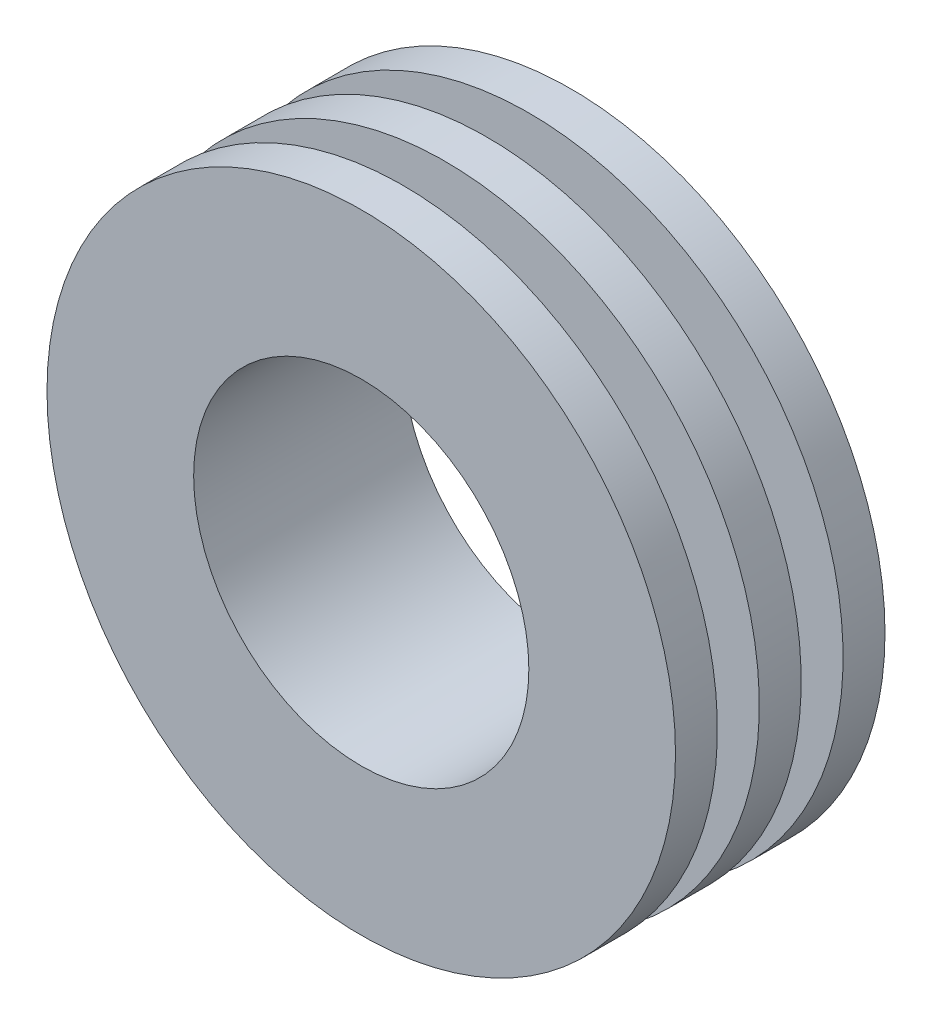
ISO-10303-21;
HEADER;
FILE_DESCRIPTION(('STEP AP214'),'2;1');
FILE_NAME('part.step','',(''),(''),'','','');
FILE_SCHEMA(('AUTOMOTIVE_DESIGN { 1 0 10303 214 1 1 1 1 }'));
ENDSEC;
DATA;
#1=APPLICATION_CONTEXT('core data for automotive mechanical design processes');
#2=APPLICATION_PROTOCOL_DEFINITION('international standard','automotive_design',2000,#1);
#3=PRODUCT_CONTEXT('',#1,'mechanical');
#4=PRODUCT('Part','Part','',(#3));
#5=PRODUCT_RELATED_PRODUCT_CATEGORY('part','',(#4));
#6=PRODUCT_DEFINITION_FORMATION('','',#4);
#7=PRODUCT_DEFINITION_CONTEXT('part definition',#1,'design');
#8=PRODUCT_DEFINITION('design','',#6,#7);
#9=PRODUCT_DEFINITION_SHAPE('','',#8);
#10=(LENGTH_UNIT() NAMED_UNIT(*) SI_UNIT(.MILLI.,.METRE.));
#11=(NAMED_UNIT(*) PLANE_ANGLE_UNIT() SI_UNIT($,.RADIAN.));
#12=(NAMED_UNIT(*) SI_UNIT($,.STERADIAN.) SOLID_ANGLE_UNIT());
#13=UNCERTAINTY_MEASURE_WITH_UNIT(LENGTH_MEASURE(1.E-05),#10,'distance_accuracy_value','');
#14=(GEOMETRIC_REPRESENTATION_CONTEXT(3) GLOBAL_UNCERTAINTY_ASSIGNED_CONTEXT((#13)) GLOBAL_UNIT_ASSIGNED_CONTEXT((#10,
#11,#12)) REPRESENTATION_CONTEXT('',''));
#15=CARTESIAN_POINT('',(0.,0.,0.));
#16=DIRECTION('',(0.,0.,1.));
#17=DIRECTION('',(1.,0.,0.));
#18=AXIS2_PLACEMENT_3D('',#15,#16,#17);
#19=CARTESIAN_POINT('',(0.,0.,5.));
#20=DIRECTION('',(0.,0.,-1.));
#21=DIRECTION('',(-1.,0.,0.));
#22=AXIS2_PLACEMENT_3D('',#19,#20,#21);
#23=CYLINDRICAL_SURFACE('',#22,7.5);
#24=CARTESIAN_POINT('',(0.,0.,2.));
#25=DIRECTION('',(0.,0.,-1.));
#26=DIRECTION('',(-1.,0.,0.));
#27=AXIS2_PLACEMENT_3D('',#24,#25,#26);
#28=CIRCLE('',#27,7.5);
#29=CARTESIAN_POINT('',(-7.5,0.,2.));
#30=VERTEX_POINT('',#29);
#31=EDGE_CURVE('E63',#30,#30,#28,.T.);
#32=ORIENTED_EDGE('',*,*,#31,.F.);
#33=EDGE_LOOP('',(#32));
#34=FACE_BOUND('',#33,.T.);
#35=CARTESIAN_POINT('',(0.,0.,3.));
#36=DIRECTION('',(0.,0.,-1.));
#37=DIRECTION('',(-1.,0.,0.));
#38=AXIS2_PLACEMENT_3D('',#35,#36,#37);
#39=CIRCLE('',#38,7.5);
#40=CARTESIAN_POINT('',(-7.5,0.,3.));
#41=VERTEX_POINT('',#40);
#42=EDGE_CURVE('E57',#41,#41,#39,.T.);
#43=ORIENTED_EDGE('',*,*,#42,.T.);
#44=EDGE_LOOP('',(#43));
#45=FACE_BOUND('',#44,.T.);
#46=ADVANCED_FACE('F33',(#34,#45),#23,.T.);
#47=CARTESIAN_POINT('',(0.,0.,4.));
#48=DIRECTION('',(0.,0.,-1.));
#49=DIRECTION('',(-1.,0.,0.));
#50=AXIS2_PLACEMENT_3D('',#47,#48,#49);
#51=CIRCLE('',#50,7.5);
#52=CARTESIAN_POINT('',(-7.5,0.,4.));
#53=VERTEX_POINT('',#52);
#54=EDGE_CURVE('E60',#53,#53,#51,.T.);
#55=ORIENTED_EDGE('',*,*,#54,.F.);
#56=EDGE_LOOP('',(#55));
#57=FACE_BOUND('',#56,.T.);
#58=CARTESIAN_POINT('',(0.,0.,5.));
#59=DIRECTION('',(0.,0.,1.));
#60=DIRECTION('',(1.,0.,0.));
#61=AXIS2_PLACEMENT_3D('',#58,#59,#60);
#62=CIRCLE('',#61,7.5);
#63=CARTESIAN_POINT('',(7.5,0.,5.));
#64=VERTEX_POINT('',#63);
#65=EDGE_CURVE('E10',#64,#64,#62,.T.);
#66=ORIENTED_EDGE('',*,*,#65,.F.);
#67=EDGE_LOOP('',(#66));
#68=FACE_BOUND('',#67,.T.);
#69=ADVANCED_FACE('F99',(#57,#68),#23,.T.);
#70=CARTESIAN_POINT('',(0.,0.,5.));
#71=DIRECTION('',(0.,0.,1.));
#72=DIRECTION('',(1.,0.,0.));
#73=AXIS2_PLACEMENT_3D('',#70,#71,#72);
#74=PLANE('',#73);
#75=ORIENTED_EDGE('',*,*,#65,.T.);
#76=EDGE_LOOP('',(#75));
#77=FACE_BOUND('',#76,.T.);
#78=CARTESIAN_POINT('',(0.,0.,5.));
#79=DIRECTION('',(0.,0.,1.));
#80=DIRECTION('',(1.,0.,0.));
#81=AXIS2_PLACEMENT_3D('',#78,#79,#80);
#82=CIRCLE('',#81,4.);
#83=CARTESIAN_POINT('',(4.,0.,5.));
#84=VERTEX_POINT('',#83);
#85=EDGE_CURVE('E44',#84,#84,#82,.T.);
#86=ORIENTED_EDGE('',*,*,#85,.F.);
#87=EDGE_LOOP('',(#86));
#88=FACE_BOUND('',#87,.T.);
#89=ADVANCED_FACE('F122',(#77,#88),#74,.T.);
#90=CARTESIAN_POINT('',(0.,0.,0.));
#91=DIRECTION('',(0.,0.,1.));
#92=DIRECTION('',(1.,0.,0.));
#93=AXIS2_PLACEMENT_3D('',#90,#91,#92);
#94=PLANE('',#93);
#95=CARTESIAN_POINT('',(0.,0.,0.));
#96=DIRECTION('',(0.,0.,1.));
#97=DIRECTION('',(1.,0.,0.));
#98=AXIS2_PLACEMENT_3D('',#95,#96,#97);
#99=CIRCLE('',#98,7.5);
#100=CARTESIAN_POINT('',(7.5,0.,0.));
#101=VERTEX_POINT('',#100);
#102=EDGE_CURVE('E37',#101,#101,#99,.T.);
#103=ORIENTED_EDGE('',*,*,#102,.F.);
#104=EDGE_LOOP('',(#103));
#105=FACE_BOUND('',#104,.T.);
#106=CARTESIAN_POINT('',(0.,0.,0.));
#107=DIRECTION('',(0.,0.,1.));
#108=DIRECTION('',(1.,0.,0.));
#109=AXIS2_PLACEMENT_3D('',#106,#107,#108);
#110=CIRCLE('',#109,4.);
#111=CARTESIAN_POINT('',(4.,0.,0.));
#112=VERTEX_POINT('',#111);
#113=EDGE_CURVE('E46',#112,#112,#110,.T.);
#114=ORIENTED_EDGE('',*,*,#113,.T.);
#115=EDGE_LOOP('',(#114));
#116=FACE_BOUND('',#115,.T.);
#117=ADVANCED_FACE('F126',(#105,#116),#94,.F.);
#118=CARTESIAN_POINT('',(0.,0.,1.));
#119=DIRECTION('',(0.,0.,-1.));
#120=DIRECTION('',(-1.,0.,0.));
#121=AXIS2_PLACEMENT_3D('',#118,#119,#120);
#122=CIRCLE('',#121,7.5);
#123=CARTESIAN_POINT('',(-7.5,0.,1.));
#124=VERTEX_POINT('',#123);
#125=EDGE_CURVE('E72',#124,#124,#122,.T.);
#126=ORIENTED_EDGE('',*,*,#125,.T.);
#127=EDGE_LOOP('',(#126));
#128=FACE_BOUND('',#127,.T.);
#129=ORIENTED_EDGE('',*,*,#102,.T.);
#130=EDGE_LOOP('',(#129));
#131=FACE_BOUND('',#130,.T.);
#132=ADVANCED_FACE('F35',(#128,#131),#23,.T.);
#133=CARTESIAN_POINT('',(0.,0.,5.));
#134=DIRECTION('',(0.,0.,-1.));
#135=DIRECTION('',(-1.,0.,0.));
#136=AXIS2_PLACEMENT_3D('',#133,#134,#135);
#137=CYLINDRICAL_SURFACE('',#136,4.);
#138=ORIENTED_EDGE('',*,*,#85,.T.);
#139=EDGE_LOOP('',(#138));
#140=FACE_BOUND('',#139,.T.);
#141=ORIENTED_EDGE('',*,*,#113,.F.);
#142=EDGE_LOOP('',(#141));
#143=FACE_BOUND('',#142,.T.);
#144=ADVANCED_FACE('F116',(#140,#143),#137,.F.);
#145=CARTESIAN_POINT('',(0.,7.5,4.));
#146=DIRECTION('',(0.,0.,1.));
#147=DIRECTION('',(1.,0.,0.));
#148=AXIS2_PLACEMENT_3D('',#145,#146,#147);
#149=PLANE('',#148);
#150=CARTESIAN_POINT('',(0.,0.,4.));
#151=DIRECTION('',(0.,0.,-1.));
#152=DIRECTION('',(-1.,0.,0.));
#153=AXIS2_PLACEMENT_3D('',#150,#151,#152);
#154=CIRCLE('',#153,6.);
#155=CARTESIAN_POINT('',(-6.,0.,4.));
#156=VERTEX_POINT('',#155);
#157=EDGE_CURVE('E49',#156,#156,#154,.T.);
#158=ORIENTED_EDGE('',*,*,#157,.F.);
#159=EDGE_LOOP('',(#158));
#160=FACE_BOUND('',#159,.T.);
#161=ORIENTED_EDGE('',*,*,#54,.T.);
#162=EDGE_LOOP('',(#161));
#163=FACE_BOUND('',#162,.T.);
#164=ADVANCED_FACE('F110',(#160,#163),#149,.F.);
#165=CARTESIAN_POINT('',(0.,0.,0.));
#166=DIRECTION('',(0.,0.,-1.));
#167=DIRECTION('',(-1.,0.,0.));
#168=AXIS2_PLACEMENT_3D('',#165,#166,#167);
#169=CYLINDRICAL_SURFACE('',#168,6.);
#170=CARTESIAN_POINT('',(0.,0.,3.));
#171=DIRECTION('',(0.,0.,-1.));
#172=DIRECTION('',(-1.,0.,0.));
#173=AXIS2_PLACEMENT_3D('',#170,#171,#172);
#174=CIRCLE('',#173,6.);
#175=CARTESIAN_POINT('',(-6.,0.,3.));
#176=VERTEX_POINT('',#175);
#177=EDGE_CURVE('E54',#176,#176,#174,.T.);
#178=ORIENTED_EDGE('',*,*,#177,.F.);
#179=EDGE_LOOP('',(#178));
#180=FACE_BOUND('',#179,.T.);
#181=ORIENTED_EDGE('',*,*,#157,.T.);
#182=EDGE_LOOP('',(#181));
#183=FACE_BOUND('',#182,.T.);
#184=ADVANCED_FACE('F104',(#180,#183),#169,.T.);
#185=CARTESIAN_POINT('',(0.,7.5,3.));
#186=DIRECTION('',(0.,0.,-1.));
#187=DIRECTION('',(-1.,0.,0.));
#188=AXIS2_PLACEMENT_3D('',#185,#186,#187);
#189=PLANE('',#188);
#190=ORIENTED_EDGE('',*,*,#42,.F.);
#191=EDGE_LOOP('',(#190));
#192=FACE_BOUND('',#191,.T.);
#193=ORIENTED_EDGE('',*,*,#177,.T.);
#194=EDGE_LOOP('',(#193));
#195=FACE_BOUND('',#194,.T.);
#196=ADVANCED_FACE('F93',(#192,#195),#189,.F.);
#197=CARTESIAN_POINT('',(0.,7.5,2.));
#198=DIRECTION('',(0.,0.,1.));
#199=DIRECTION('',(1.,0.,0.));
#200=AXIS2_PLACEMENT_3D('',#197,#198,#199);
#201=PLANE('',#200);
#202=CARTESIAN_POINT('',(0.,0.,2.));
#203=DIRECTION('',(0.,0.,-1.));
#204=DIRECTION('',(-1.,0.,0.));
#205=AXIS2_PLACEMENT_3D('',#202,#203,#204);
#206=CIRCLE('',#205,6.);
#207=CARTESIAN_POINT('',(-6.,0.,2.));
#208=VERTEX_POINT('',#207);
#209=EDGE_CURVE('E66',#208,#208,#206,.T.);
#210=ORIENTED_EDGE('',*,*,#209,.F.);
#211=EDGE_LOOP('',(#210));
#212=FACE_BOUND('',#211,.T.);
#213=ORIENTED_EDGE('',*,*,#31,.T.);
#214=EDGE_LOOP('',(#213));
#215=FACE_BOUND('',#214,.T.);
#216=ADVANCED_FACE('F87',(#212,#215),#201,.F.);
#217=CARTESIAN_POINT('',(0.,0.,0.));
#218=DIRECTION('',(0.,0.,-1.));
#219=DIRECTION('',(-1.,0.,0.));
#220=AXIS2_PLACEMENT_3D('',#217,#218,#219);
#221=CYLINDRICAL_SURFACE('',#220,6.);
#222=CARTESIAN_POINT('',(0.,0.,1.));
#223=DIRECTION('',(0.,0.,-1.));
#224=DIRECTION('',(-1.,0.,0.));
#225=AXIS2_PLACEMENT_3D('',#222,#223,#224);
#226=CIRCLE('',#225,6.);
#227=CARTESIAN_POINT('',(-6.,0.,1.));
#228=VERTEX_POINT('',#227);
#229=EDGE_CURVE('E69',#228,#228,#226,.T.);
#230=ORIENTED_EDGE('',*,*,#229,.F.);
#231=EDGE_LOOP('',(#230));
#232=FACE_BOUND('',#231,.T.);
#233=ORIENTED_EDGE('',*,*,#209,.T.);
#234=EDGE_LOOP('',(#233));
#235=FACE_BOUND('',#234,.T.);
#236=ADVANCED_FACE('F81',(#232,#235),#221,.T.);
#237=CARTESIAN_POINT('',(0.,7.5,1.));
#238=DIRECTION('',(0.,0.,-1.));
#239=DIRECTION('',(-1.,0.,0.));
#240=AXIS2_PLACEMENT_3D('',#237,#238,#239);
#241=PLANE('',#240);
#242=ORIENTED_EDGE('',*,*,#125,.F.);
#243=EDGE_LOOP('',(#242));
#244=FACE_BOUND('',#243,.T.);
#245=ORIENTED_EDGE('',*,*,#229,.T.);
#246=EDGE_LOOP('',(#245));
#247=FACE_BOUND('',#246,.T.);
#248=ADVANCED_FACE('F78',(#244,#247),#241,.F.);
#249=CLOSED_SHELL('',(#46,#69,#89,#117,#132,#144,#164,#184,#196,#216,#236,#248));
#250=MANIFOLD_SOLID_BREP('B2',#249);
#251=ADVANCED_BREP_SHAPE_REPRESENTATION('',(#18,#250),#14);
#252=SHAPE_DEFINITION_REPRESENTATION(#9,#251);
ENDSEC;
END-ISO-10303-21;
